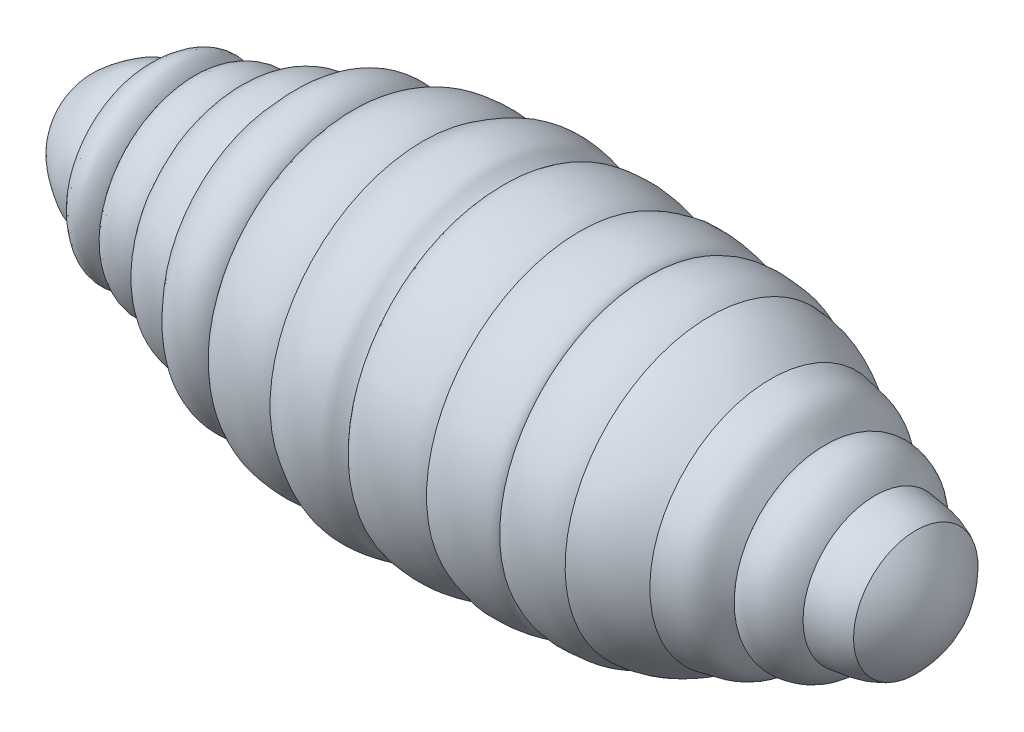
ISO-10303-21;
HEADER;
FILE_DESCRIPTION(('STEP AP214'),'2;1');
FILE_NAME('part.step','',(''),(''),'','','');
FILE_SCHEMA(('AUTOMOTIVE_DESIGN { 1 0 10303 214 1 1 1 1 }'));
ENDSEC;
DATA;
#1=APPLICATION_CONTEXT('core data for automotive mechanical design processes');
#2=APPLICATION_PROTOCOL_DEFINITION('international standard','automotive_design',2000,#1);
#3=PRODUCT_CONTEXT('',#1,'mechanical');
#4=PRODUCT('Part','Part','',(#3));
#5=PRODUCT_RELATED_PRODUCT_CATEGORY('part','',(#4));
#6=PRODUCT_DEFINITION_FORMATION('','',#4);
#7=PRODUCT_DEFINITION_CONTEXT('part definition',#1,'design');
#8=PRODUCT_DEFINITION('design','',#6,#7);
#9=PRODUCT_DEFINITION_SHAPE('','',#8);
#10=(LENGTH_UNIT() NAMED_UNIT(*) SI_UNIT(.MILLI.,.METRE.));
#11=(NAMED_UNIT(*) PLANE_ANGLE_UNIT() SI_UNIT($,.RADIAN.));
#12=(NAMED_UNIT(*) SI_UNIT($,.STERADIAN.) SOLID_ANGLE_UNIT());
#13=UNCERTAINTY_MEASURE_WITH_UNIT(LENGTH_MEASURE(1.E-05),#10,'distance_accuracy_value','');
#14=(GEOMETRIC_REPRESENTATION_CONTEXT(3) GLOBAL_UNCERTAINTY_ASSIGNED_CONTEXT((#13)) GLOBAL_UNIT_ASSIGNED_CONTEXT((#10,
#11,#12)) REPRESENTATION_CONTEXT('',''));
#15=CARTESIAN_POINT('',(0.,0.,0.));
#16=DIRECTION('',(0.,0.,1.));
#17=DIRECTION('',(1.,0.,0.));
#18=AXIS2_PLACEMENT_3D('',#15,#16,#17);
#19=CARTESIAN_POINT('',(-50.,0.,0.));
#20=CARTESIAN_POINT('',(-49.8904700324615,1.50509251192871,0.));
#21=CARTESIAN_POINT('',(-49.363729422387,4.50625430356472,0.));
#22=CARTESIAN_POINT('',(-46.5862063777801,6.57244305367213,0.));
#23=CARTESIAN_POINT('',(-44.381278745051,8.04243325560071,0.));
#24=CARTESIAN_POINT('',(-42.8694731297711,8.26708534150104,0.));
#25=CARTESIAN_POINT('',(-42.,8.28104738789359,0.));
#26=B_SPLINE_CURVE_WITH_KNOTS('',3,(#19,#20,#21,#22,#23,#24,#25),.UNSPECIFIED.,.F.,.F.,(4,1,1,1,
4),(0.,0.374016398351555,0.653478009580749,0.790960400203456,1.),.UNSPECIFIED.);
#27=CARTESIAN_POINT('',(-50.,0.,0.));
#28=DIRECTION('',(-1.,0.,0.));
#29=AXIS1_PLACEMENT('',#27,#28);
#30=SURFACE_OF_REVOLUTION('',#26,#29);
#31=CARTESIAN_POINT('',(-49.5476110758797,0.,0.));
#32=DIRECTION('',(-1.,0.,0.));
#33=DIRECTION('',(0.,-1.,0.));
#34=AXIS2_PLACEMENT_3D('',#31,#32,#33);
#35=CIRCLE('',#34,2.68430211931101);
#36=CARTESIAN_POINT('',(-49.5476110758797,-2.68430211931102,0.));
#37=VERTEX_POINT('',#36);
#38=EDGE_CURVE('E85',#37,#37,#35,.T.);
#39=ORIENTED_EDGE('',*,*,#38,.T.);
#40=EDGE_LOOP('',(#39));
#41=FACE_BOUND('',#40,.T.);
#42=CARTESIAN_POINT('',(-50.,0.,0.));
#43=VERTEX_POINT('',#42);
#44=VERTEX_LOOP('',#43);
#45=FACE_BOUND('',#44,.T.);
#46=ADVANCED_FACE('F35',(#41,#45),#30,.F.);
#47=CARTESIAN_POINT('',(50.,0.,0.));
#48=CARTESIAN_POINT('',(49.9997063551662,1.83528020877926,0.));
#49=CARTESIAN_POINT('',(49.1652497316057,3.63930144569189,0.));
#50=CARTESIAN_POINT('',(48.3309716119096,5.44293677307604,0.));
#51=CARTESIAN_POINT('',(46.6888712468462,7.15708657704143,0.));
#52=B_SPLINE_CURVE_WITH_KNOTS('',2,(#47,#48,#49,#50,#51),.UNSPECIFIED.,.F.,.F.,(3,2,3),(0.,0.5,
1.),.UNSPECIFIED.);
#53=CARTESIAN_POINT('',(-50.,0.,0.));
#54=DIRECTION('',(-1.,0.,0.));
#55=AXIS1_PLACEMENT('',#53,#54);
#56=SURFACE_OF_REVOLUTION('',#52,#55);
#57=CARTESIAN_POINT('',(46.6888712468464,0.,0.));
#58=DIRECTION('',(-1.,0.,0.));
#59=DIRECTION('',(0.,1.,0.));
#60=AXIS2_PLACEMENT_3D('',#57,#58,#59);
#61=CIRCLE('',#60,7.15708657704127);
#62=CARTESIAN_POINT('',(46.6888712468464,7.15708657704127,0.));
#63=VERTEX_POINT('',#62);
#64=EDGE_CURVE('E11',#63,#63,#61,.T.);
#65=ORIENTED_EDGE('',*,*,#64,.F.);
#66=EDGE_LOOP('',(#65));
#67=FACE_BOUND('',#66,.T.);
#68=CARTESIAN_POINT('',(50.,0.,0.));
#69=VERTEX_POINT('',#68);
#70=VERTEX_LOOP('',#69);
#71=FACE_BOUND('',#70,.T.);
#72=ADVANCED_FACE('F37',(#67,#71),#56,.T.);
#73=CARTESIAN_POINT('',(42.,8.28104738789359,0.));
#74=CARTESIAN_POINT('',(43.5955919784813,8.09543828768739,0.));
#75=CARTESIAN_POINT('',(45.2531179201532,7.96065524423312,0.));
#76=CARTESIAN_POINT('',(46.6888712468464,7.15708657704127,0.));
#77=B_SPLINE_CURVE_WITH_KNOTS('',3,(#73,#74,#75,#76),.UNSPECIFIED.,.F.,.F.,(4,4),(0.,1.),.UNSPECIFIED.);
#78=CARTESIAN_POINT('',(-50.,0.,0.));
#79=DIRECTION('',(-1.,0.,0.));
#80=AXIS1_PLACEMENT('',#78,#79);
#81=SURFACE_OF_REVOLUTION('',#77,#80);
#82=ORIENTED_EDGE('',*,*,#64,.T.);
#83=EDGE_LOOP('',(#82));
#84=FACE_BOUND('',#83,.T.);
#85=CARTESIAN_POINT('',(42.,0.,0.));
#86=DIRECTION('',(-1.,0.,0.));
#87=DIRECTION('',(0.,-1.,0.));
#88=AXIS2_PLACEMENT_3D('',#85,#86,#87);
#89=CIRCLE('',#88,8.28104738789359);
#90=CARTESIAN_POINT('',(42.,-8.28104738789358,0.));
#91=VERTEX_POINT('',#90);
#92=EDGE_CURVE('E47',#91,#91,#89,.T.);
#93=ORIENTED_EDGE('',*,*,#92,.F.);
#94=EDGE_LOOP('',(#93));
#95=FACE_BOUND('',#94,.T.);
#96=ADVANCED_FACE('F60',(#84,#95),#81,.F.);
#97=CARTESIAN_POINT('',(36.,10.0967700152084,0.));
#98=CARTESIAN_POINT('',(36.1648997740849,10.4394423191181,0.));
#99=CARTESIAN_POINT('',(36.6963517795307,10.8691492370424,0.));
#100=CARTESIAN_POINT('',(37.745862760455,11.0782128664449,0.));
#101=CARTESIAN_POINT('',(38.6875001009525,10.8757792862498,0.));
#102=CARTESIAN_POINT('',(39.765691934058,10.5497597271227,0.));
#103=CARTESIAN_POINT('',(40.8970845261141,9.68208773770644,0.));
#104=CARTESIAN_POINT('',(41.6422223563437,8.85342200247426,0.));
#105=CARTESIAN_POINT('',(42.,8.28104738789359,0.));
#106=B_SPLINE_CURVE_WITH_KNOTS('',3,(#97,#98,#99,#100,#101,#102,#103,#104,#105),.UNSPECIFIED.,
.F.,.F.,(4,1,1,1,1,1,4),(0.,0.152464572931677,0.266191497924167,0.427434588880055,
0.541585927712012,0.725793911544838,1.),.UNSPECIFIED.);
#107=CARTESIAN_POINT('',(-50.,0.,0.));
#108=DIRECTION('',(-1.,0.,0.));
#109=AXIS1_PLACEMENT('',#107,#108);
#110=SURFACE_OF_REVOLUTION('',#106,#109);
#111=ORIENTED_EDGE('',*,*,#92,.T.);
#112=EDGE_LOOP('',(#111));
#113=FACE_BOUND('',#112,.T.);
#114=CARTESIAN_POINT('',(36.,0.,0.));
#115=DIRECTION('',(-1.,0.,0.));
#116=DIRECTION('',(0.,-1.,0.));
#117=AXIS2_PLACEMENT_3D('',#114,#115,#116);
#118=CIRCLE('',#117,10.0967700152084);
#119=CARTESIAN_POINT('',(36.,-10.0967700152084,0.));
#120=VERTEX_POINT('',#119);
#121=EDGE_CURVE('E120',#120,#120,#118,.T.);
#122=ORIENTED_EDGE('',*,*,#121,.F.);
#123=EDGE_LOOP('',(#122));
#124=FACE_BOUND('',#123,.T.);
#125=ADVANCED_FACE('F139',(#113,#124),#110,.F.);
#126=CARTESIAN_POINT('',(30.,13.9037401965799,0.));
#127=CARTESIAN_POINT('',(31.1983333416806,13.6198257245417,0.));
#128=CARTESIAN_POINT('',(34.0789157247043,13.5061248181912,0.));
#129=CARTESIAN_POINT('',(35.3497922038353,11.0047350326224,0.));
#130=CARTESIAN_POINT('',(36.,10.0967700152084,0.));
#131=B_SPLINE_CURVE_WITH_KNOTS('',3,(#126,#127,#128,#129,#130),.UNSPECIFIED.,.F.,.F.,(4,1,4),
(0.,0.529447084413405,1.),.UNSPECIFIED.);
#132=CARTESIAN_POINT('',(-50.,0.,0.));
#133=DIRECTION('',(-1.,0.,0.));
#134=AXIS1_PLACEMENT('',#132,#133);
#135=SURFACE_OF_REVOLUTION('',#131,#134);
#136=ORIENTED_EDGE('',*,*,#121,.T.);
#137=EDGE_LOOP('',(#136));
#138=FACE_BOUND('',#137,.T.);
#139=CARTESIAN_POINT('',(30.,0.,0.));
#140=DIRECTION('',(-1.,0.,0.));
#141=DIRECTION('',(0.,-1.,0.));
#142=AXIS2_PLACEMENT_3D('',#139,#140,#141);
#143=CIRCLE('',#142,13.9037401965799);
#144=CARTESIAN_POINT('',(30.,-13.9037401965799,0.));
#145=VERTEX_POINT('',#144);
#146=EDGE_CURVE('E117',#145,#145,#143,.T.);
#147=ORIENTED_EDGE('',*,*,#146,.F.);
#148=EDGE_LOOP('',(#147));
#149=FACE_BOUND('',#148,.T.);
#150=ADVANCED_FACE('F169',(#138,#149),#135,.F.);
#151=CARTESIAN_POINT('',(23.,16.6479798239174,0.));
#152=CARTESIAN_POINT('',(25.6210132962744,16.5633102642351,0.));
#153=CARTESIAN_POINT('',(27.9044349307184,15.3073779247023,0.));
#154=CARTESIAN_POINT('',(30.,13.9037401965799,0.));
#155=B_SPLINE_CURVE_WITH_KNOTS('',3,(#151,#152,#153,#154),.UNSPECIFIED.,.F.,.F.,(4,4),(0.,1.),.UNSPECIFIED.);
#156=CARTESIAN_POINT('',(-50.,0.,0.));
#157=DIRECTION('',(-1.,0.,0.));
#158=AXIS1_PLACEMENT('',#156,#157);
#159=SURFACE_OF_REVOLUTION('',#155,#158);
#160=ORIENTED_EDGE('',*,*,#146,.T.);
#161=EDGE_LOOP('',(#160));
#162=FACE_BOUND('',#161,.T.);
#163=CARTESIAN_POINT('',(23.,0.,0.));
#164=DIRECTION('',(-1.,0.,0.));
#165=DIRECTION('',(0.,-1.,0.));
#166=AXIS2_PLACEMENT_3D('',#163,#164,#165);
#167=CIRCLE('',#166,16.6479798239174);
#168=CARTESIAN_POINT('',(23.,-16.6479798239174,0.));
#169=VERTEX_POINT('',#168);
#170=EDGE_CURVE('E114',#169,#169,#167,.T.);
#171=ORIENTED_EDGE('',*,*,#170,.F.);
#172=EDGE_LOOP('',(#171));
#173=FACE_BOUND('',#172,.T.);
#174=ADVANCED_FACE('F172',(#162,#173),#159,.F.);
#175=CARTESIAN_POINT('',(16.,17.1727696263886,0.));
#176=CARTESIAN_POINT('',(16.4092306846909,17.3968524585221,0.));
#177=CARTESIAN_POINT('',(17.0185438711078,17.5894532577867,0.));
#178=CARTESIAN_POINT('',(17.9071210774252,17.6388000058519,0.));
#179=CARTESIAN_POINT('',(18.2046930613381,17.6823657132867,0.));
#180=CARTESIAN_POINT('',(18.607659449331,17.6808848623169,0.));
#181=CARTESIAN_POINT('',(18.9514869908962,17.6412399103501,0.));
#182=CARTESIAN_POINT('',(20.3135688490514,17.5548759143627,0.));
#183=CARTESIAN_POINT('',(21.4096312816425,17.4389186139164,0.));
#184=CARTESIAN_POINT('',(22.5448340930615,16.9224433203292,0.));
#185=CARTESIAN_POINT('',(23.,16.6479798239174,0.));
#186=B_SPLINE_CURVE_WITH_KNOTS('',3,(#175,#176,#177,#178,#179,#180,#181,#182,#183,#184,#185),
.UNSPECIFIED.,.F.,.F.,(4,1,1,1,1,1,1,1,4),(0.,0.20115166025893,0.294305631612312,
0.364002236395487,0.3814152572732,0.468435840389441,0.54569185567994,0.779325231246277,1.),.UNSPECIFIED.);
#187=CARTESIAN_POINT('',(-50.,0.,0.));
#188=DIRECTION('',(-1.,0.,0.));
#189=AXIS1_PLACEMENT('',#187,#188);
#190=SURFACE_OF_REVOLUTION('',#186,#189);
#191=ORIENTED_EDGE('',*,*,#170,.T.);
#192=EDGE_LOOP('',(#191));
#193=FACE_BOUND('',#192,.T.);
#194=CARTESIAN_POINT('',(16.,0.,0.));
#195=DIRECTION('',(-1.,0.,0.));
#196=DIRECTION('',(0.,-1.,0.));
#197=AXIS2_PLACEMENT_3D('',#194,#195,#196);
#198=CIRCLE('',#197,17.1727696263885);
#199=CARTESIAN_POINT('',(16.,-17.1727696263885,0.));
#200=VERTEX_POINT('',#199);
#201=EDGE_CURVE('E111',#200,#200,#198,.T.);
#202=ORIENTED_EDGE('',*,*,#201,.F.);
#203=EDGE_LOOP('',(#202));
#204=FACE_BOUND('',#203,.T.);
#205=ADVANCED_FACE('F176',(#193,#204),#190,.F.);
#206=CARTESIAN_POINT('',(7.99999999999998,17.58879558299,0.));
#207=CARTESIAN_POINT('',(8.58195172244521,17.8804159787155,0.));
#208=CARTESIAN_POINT('',(9.43998916263691,18.0527990013269,0.));
#209=CARTESIAN_POINT('',(10.5081521326243,18.334125133584,0.));
#210=CARTESIAN_POINT('',(11.0618501999922,18.2976534538103,0.));
#211=CARTESIAN_POINT('',(11.5040455510617,18.2994251244907,0.));
#212=CARTESIAN_POINT('',(11.8663632179127,18.3093296074904,0.));
#213=CARTESIAN_POINT('',(12.2606155330468,18.2674280029491,0.));
#214=CARTESIAN_POINT('',(12.6390768169979,18.2311689979446,0.));
#215=CARTESIAN_POINT('',(12.9995380189958,18.1871859247805,0.));
#216=CARTESIAN_POINT('',(13.4294768607219,18.1315994240063,0.));
#217=CARTESIAN_POINT('',(14.0354190365389,18.0081948464241,0.));
#218=CARTESIAN_POINT('',(14.9736986439508,17.8254983824232,0.));
#219=CARTESIAN_POINT('',(15.7088977452917,17.5561704027527,0.));
#220=CARTESIAN_POINT('',(16.,17.1727696263885,0.));
#221=B_SPLINE_CURVE_WITH_KNOTS('',3,(#206,#207,#208,#209,#210,#211,#212,#213,#214,#215,#216,
#217,#218,#219,#220),.UNSPECIFIED.,.F.,.F.,(4,1,1,1,1,1,1,1,1,1,1,1,4),(0.,0.229372754582656,
0.317536007236325,0.393855893615315,0.427343111732747,0.476843965174335,0.524044558774018,
0.569820456887553,0.613701787293404,0.654707151740502,0.725801780216515,0.83593387589124,1.),.UNSPECIFIED.);
#222=CARTESIAN_POINT('',(-50.,0.,0.));
#223=DIRECTION('',(-1.,0.,0.));
#224=AXIS1_PLACEMENT('',#222,#223);
#225=SURFACE_OF_REVOLUTION('',#221,#224);
#226=ORIENTED_EDGE('',*,*,#201,.T.);
#227=EDGE_LOOP('',(#226));
#228=FACE_BOUND('',#227,.T.);
#229=CARTESIAN_POINT('',(7.99999999999999,0.,0.));
#230=DIRECTION('',(-1.,0.,0.));
#231=DIRECTION('',(0.,-1.,0.));
#232=AXIS2_PLACEMENT_3D('',#229,#230,#231);
#233=CIRCLE('',#232,17.58879558299);
#234=CARTESIAN_POINT('',(7.99999999999999,-17.58879558299,0.));
#235=VERTEX_POINT('',#234);
#236=EDGE_CURVE('E108',#235,#235,#233,.T.);
#237=ORIENTED_EDGE('',*,*,#236,.F.);
#238=EDGE_LOOP('',(#237));
#239=FACE_BOUND('',#238,.T.);
#240=ADVANCED_FACE('F180',(#228,#239),#225,.F.);
#241=CARTESIAN_POINT('',(-1.00000000000002,17.58879558299,0.));
#242=CARTESIAN_POINT('',(-0.614381517490259,18.1042013550658,0.));
#243=CARTESIAN_POINT('',(0.333735079944587,18.632641408761,0.));
#244=CARTESIAN_POINT('',(1.65279448140818,18.7237738313502,0.));
#245=CARTESIAN_POINT('',(2.53495210967577,18.794772533689,0.));
#246=CARTESIAN_POINT('',(3.2722451551941,18.7961807507217,0.));
#247=CARTESIAN_POINT('',(3.89160746997234,18.7458650543614,0.));
#248=CARTESIAN_POINT('',(4.47522000834908,18.667212173481,0.));
#249=CARTESIAN_POINT('',(4.99223252068977,18.5615601771135,0.));
#250=CARTESIAN_POINT('',(5.54256250629083,18.4666664859525,0.));
#251=CARTESIAN_POINT('',(6.11477590126522,18.2846224684002,0.));
#252=CARTESIAN_POINT('',(6.6811895763478,18.1832914009895,0.));
#253=CARTESIAN_POINT('',(7.33054937110865,17.9804058142008,0.));
#254=CARTESIAN_POINT('',(7.73759263743826,17.748797975174,0.));
#255=CARTESIAN_POINT('',(7.99999999999998,17.58879558299,0.));
#256=B_SPLINE_CURVE_WITH_KNOTS('',3,(#241,#242,#243,#244,#245,#246,#247,#248,#249,#250,#251,
#252,#253,#254,#255),.UNSPECIFIED.,.F.,.F.,(4,1,1,1,1,1,1,1,1,1,1,1,4),(0.,0.199993369543529,
0.323104104368617,0.414620343601679,0.47925154603547,0.555247359146551,0.610372734943505,
0.664792721977809,0.721612681011752,0.786226372903281,0.853650458042409,0.902782427386736,1.),.UNSPECIFIED.);
#257=CARTESIAN_POINT('',(-50.,0.,0.));
#258=DIRECTION('',(-1.,0.,0.));
#259=AXIS1_PLACEMENT('',#257,#258);
#260=SURFACE_OF_REVOLUTION('',#256,#259);
#261=ORIENTED_EDGE('',*,*,#236,.T.);
#262=EDGE_LOOP('',(#261));
#263=FACE_BOUND('',#262,.T.);
#264=CARTESIAN_POINT('',(-1.00000000000001,0.,0.));
#265=DIRECTION('',(-1.,0.,0.));
#266=DIRECTION('',(0.,-1.,0.));
#267=AXIS2_PLACEMENT_3D('',#264,#265,#266);
#268=CIRCLE('',#267,17.58879558299);
#269=CARTESIAN_POINT('',(-1.00000000000001,-17.58879558299,0.));
#270=VERTEX_POINT('',#269);
#271=EDGE_CURVE('E105',#270,#270,#268,.T.);
#272=ORIENTED_EDGE('',*,*,#271,.F.);
#273=EDGE_LOOP('',(#272));
#274=FACE_BOUND('',#273,.T.);
#275=ADVANCED_FACE('F208',(#263,#274),#260,.F.);
#276=CARTESIAN_POINT('',(-10.,17.58879558299,0.));
#277=CARTESIAN_POINT('',(-9.17764033625155,18.0865379526265,0.));
#278=CARTESIAN_POINT('',(-7.79833975548958,19.0069684286883,0.));
#279=CARTESIAN_POINT('',(-5.52354150623839,19.3180077940493,0.));
#280=CARTESIAN_POINT('',(-3.93611691289387,19.069156303444,0.));
#281=CARTESIAN_POINT('',(-2.28921186726228,18.7528788819492,0.));
#282=CARTESIAN_POINT('',(-1.61636299261944,17.8471970558595,0.));
#283=CARTESIAN_POINT('',(-1.00000000000002,17.58879558299,0.));
#284=B_SPLINE_CURVE_WITH_KNOTS('',3,(#276,#277,#278,#279,#280,#281,#282,#283),.UNSPECIFIED.,.F.,
.F.,(4,1,1,1,1,4),(0.,0.297871953056791,0.496695395077748,0.687344485397055,0.793867051889781,
1.),.UNSPECIFIED.);
#285=CARTESIAN_POINT('',(-50.,0.,0.));
#286=DIRECTION('',(-1.,0.,0.));
#287=AXIS1_PLACEMENT('',#285,#286);
#288=SURFACE_OF_REVOLUTION('',#284,#287);
#289=ORIENTED_EDGE('',*,*,#271,.T.);
#290=EDGE_LOOP('',(#289));
#291=FACE_BOUND('',#290,.T.);
#292=CARTESIAN_POINT('',(-10.,0.,0.));
#293=DIRECTION('',(-1.,0.,0.));
#294=DIRECTION('',(0.,-1.,0.));
#295=AXIS2_PLACEMENT_3D('',#292,#293,#294);
#296=CIRCLE('',#295,17.58879558299);
#297=CARTESIAN_POINT('',(-10.,-17.58879558299,0.));
#298=VERTEX_POINT('',#297);
#299=EDGE_CURVE('E102',#298,#298,#296,.T.);
#300=ORIENTED_EDGE('',*,*,#299,.F.);
#301=EDGE_LOOP('',(#300));
#302=FACE_BOUND('',#301,.T.);
#303=ADVANCED_FACE('F211',(#291,#302),#288,.F.);
#304=CARTESIAN_POINT('',(-19.,14.7813768868694,0.));
#305=CARTESIAN_POINT('',(-18.8759341950245,16.028850536088,0.));
#306=CARTESIAN_POINT('',(-17.5747081904575,17.2884400085088,0.));
#307=CARTESIAN_POINT('',(-15.5097710752355,18.0753626090936,0.));
#308=CARTESIAN_POINT('',(-14.0238921132705,18.2272210447954,0.));
#309=CARTESIAN_POINT('',(-12.1615104618129,18.3929705347467,0.));
#310=CARTESIAN_POINT('',(-10.7975743860364,18.0401145274624,0.));
#311=CARTESIAN_POINT('',(-10.,17.58879558299,0.));
#312=B_SPLINE_CURVE_WITH_KNOTS('',3,(#304,#305,#306,#307,#308,#309,#310,#311),.UNSPECIFIED.,.F.,
.F.,(4,1,1,1,1,4),(0.,0.324864627047122,0.474838109363639,0.616409351822741,0.743385769950866,
1.),.UNSPECIFIED.);
#313=CARTESIAN_POINT('',(-50.,0.,0.));
#314=DIRECTION('',(-1.,0.,0.));
#315=AXIS1_PLACEMENT('',#313,#314);
#316=SURFACE_OF_REVOLUTION('',#312,#315);
#317=ORIENTED_EDGE('',*,*,#299,.T.);
#318=EDGE_LOOP('',(#317));
#319=FACE_BOUND('',#318,.T.);
#320=CARTESIAN_POINT('',(-19.,0.,0.));
#321=DIRECTION('',(-1.,0.,0.));
#322=DIRECTION('',(0.,-1.,0.));
#323=AXIS2_PLACEMENT_3D('',#320,#321,#322);
#324=CIRCLE('',#323,14.7813768868694);
#325=CARTESIAN_POINT('',(-19.,-14.7813768868694,0.));
#326=VERTEX_POINT('',#325);
#327=EDGE_CURVE('E99',#326,#326,#324,.T.);
#328=ORIENTED_EDGE('',*,*,#327,.F.);
#329=EDGE_LOOP('',(#328));
#330=FACE_BOUND('',#329,.T.);
#331=ADVANCED_FACE('F215',(#319,#330),#316,.F.);
#332=CARTESIAN_POINT('',(-26.,13.9037401965799,0.));
#333=CARTESIAN_POINT('',(-25.2518993592873,14.6965988482443,0.));
#334=CARTESIAN_POINT('',(-24.2034123378488,16.1921795650815,0.));
#335=CARTESIAN_POINT('',(-22.1096612303888,16.6701797300599,0.));
#336=CARTESIAN_POINT('',(-20.3650098145285,16.3823642915235,0.));
#337=CARTESIAN_POINT('',(-19.344111288408,15.542594260465,0.));
#338=CARTESIAN_POINT('',(-19.,14.7813768868694,0.));
#339=B_SPLINE_CURVE_WITH_KNOTS('',3,(#332,#333,#334,#335,#336,#337,#338),.UNSPECIFIED.,.F.,.F.,
(4,1,1,1,4),(0.,0.396544676610702,0.574715816439164,0.715438823067215,1.),.UNSPECIFIED.);
#340=CARTESIAN_POINT('',(-50.,0.,0.));
#341=DIRECTION('',(-1.,0.,0.));
#342=AXIS1_PLACEMENT('',#340,#341);
#343=SURFACE_OF_REVOLUTION('',#339,#342);
#344=ORIENTED_EDGE('',*,*,#327,.T.);
#345=EDGE_LOOP('',(#344));
#346=FACE_BOUND('',#345,.T.);
#347=CARTESIAN_POINT('',(-26.,0.,0.));
#348=DIRECTION('',(-1.,0.,0.));
#349=DIRECTION('',(0.,-1.,0.));
#350=AXIS2_PLACEMENT_3D('',#347,#348,#349);
#351=CIRCLE('',#350,13.9037401965799);
#352=CARTESIAN_POINT('',(-26.,-13.9037401965799,0.));
#353=VERTEX_POINT('',#352);
#354=EDGE_CURVE('E96',#353,#353,#351,.T.);
#355=ORIENTED_EDGE('',*,*,#354,.F.);
#356=EDGE_LOOP('',(#355));
#357=FACE_BOUND('',#356,.T.);
#358=ADVANCED_FACE('F219',(#346,#357),#343,.F.);
#359=CARTESIAN_POINT('',(-32.,11.2075803757034,0.));
#360=CARTESIAN_POINT('',(-31.4638772632166,12.0955660328105,0.));
#361=CARTESIAN_POINT('',(-30.5043649253966,13.362444513894,0.));
#362=CARTESIAN_POINT('',(-28.2234485828988,14.2013610857232,0.));
#363=CARTESIAN_POINT('',(-26.870161366585,13.9918896528299,0.));
#364=CARTESIAN_POINT('',(-26.,13.9037401965799,0.));
#365=B_SPLINE_CURVE_WITH_KNOTS('',3,(#359,#360,#361,#362,#363,#364),.UNSPECIFIED.,.F.,.F.,(4,1,
1,4),(0.,0.44747716248506,0.624963351203104,1.),.UNSPECIFIED.);
#366=CARTESIAN_POINT('',(-50.,0.,0.));
#367=DIRECTION('',(-1.,0.,0.));
#368=AXIS1_PLACEMENT('',#366,#367);
#369=SURFACE_OF_REVOLUTION('',#365,#368);
#370=ORIENTED_EDGE('',*,*,#354,.T.);
#371=EDGE_LOOP('',(#370));
#372=FACE_BOUND('',#371,.T.);
#373=CARTESIAN_POINT('',(-32.,0.,0.));
#374=DIRECTION('',(-1.,0.,0.));
#375=DIRECTION('',(0.,-1.,0.));
#376=AXIS2_PLACEMENT_3D('',#373,#374,#375);
#377=CIRCLE('',#376,11.2075803757034);
#378=CARTESIAN_POINT('',(-32.,-11.2075803757034,0.));
#379=VERTEX_POINT('',#378);
#380=EDGE_CURVE('E93',#379,#379,#377,.T.);
#381=ORIENTED_EDGE('',*,*,#380,.F.);
#382=EDGE_LOOP('',(#381));
#383=FACE_BOUND('',#382,.T.);
#384=ADVANCED_FACE('F247',(#372,#383),#369,.F.);
#385=CARTESIAN_POINT('',(-37.,8.66945288548921,0.));
#386=CARTESIAN_POINT('',(-36.8749721801821,9.41025978415311,0.));
#387=CARTESIAN_POINT('',(-36.7552599978338,10.8605923923989,0.));
#388=CARTESIAN_POINT('',(-35.5564071743559,11.468057962562,0.));
#389=CARTESIAN_POINT('',(-34.9943321818747,11.7036733380231,0.));
#390=CARTESIAN_POINT('',(-34.3972152975765,11.7224176467875,0.));
#391=CARTESIAN_POINT('',(-33.846437797095,11.7326233010398,0.));
#392=CARTESIAN_POINT('',(-33.3520670008097,11.6817834967057,0.));
#393=CARTESIAN_POINT('',(-32.9352788683238,11.6252589245461,0.));
#394=CARTESIAN_POINT('',(-32.4910962335332,11.487967975443,0.));
#395=CARTESIAN_POINT('',(-32.1900861183029,11.3250953267541,0.));
#396=CARTESIAN_POINT('',(-32.,11.2075803757034,0.));
#397=B_SPLINE_CURVE_WITH_KNOTS('',3,(#385,#386,#387,#388,#389,#390,#391,#392,#393,#394,#395,
#396),.UNSPECIFIED.,.F.,.F.,(4,1,1,1,1,1,1,1,1,4),(0.,0.382043088140238,0.470299160207412,
0.564740486421525,0.641238461850231,0.723825005855344,0.80148270744285,0.854067904932874,
0.90400214142157,1.),.UNSPECIFIED.);
#398=CARTESIAN_POINT('',(-50.,0.,0.));
#399=DIRECTION('',(-1.,0.,0.));
#400=AXIS1_PLACEMENT('',#398,#399);
#401=SURFACE_OF_REVOLUTION('',#397,#400);
#402=ORIENTED_EDGE('',*,*,#380,.T.);
#403=EDGE_LOOP('',(#402));
#404=FACE_BOUND('',#403,.T.);
#405=CARTESIAN_POINT('',(-37.,0.,0.));
#406=DIRECTION('',(-1.,0.,0.));
#407=DIRECTION('',(0.,-1.,0.));
#408=AXIS2_PLACEMENT_3D('',#405,#406,#407);
#409=CIRCLE('',#408,8.66945288548921);
#410=CARTESIAN_POINT('',(-37.,-8.66945288548922,0.));
#411=VERTEX_POINT('',#410);
#412=EDGE_CURVE('E87',#411,#411,#409,.T.);
#413=ORIENTED_EDGE('',*,*,#412,.F.);
#414=EDGE_LOOP('',(#413));
#415=FACE_BOUND('',#414,.T.);
#416=ADVANCED_FACE('F75',(#404,#415),#401,.F.);
#417=CARTESIAN_POINT('',(-42.,8.28104738789359,0.));
#418=CARTESIAN_POINT('',(-41.9209287010521,9.13775934110989,0.));
#419=CARTESIAN_POINT('',(-41.0927699707231,10.0195843604941,0.));
#420=CARTESIAN_POINT('',(-39.8707565964733,10.8890489116063,0.));
#421=CARTESIAN_POINT('',(-38.9022368719954,10.9303643567224,0.));
#422=CARTESIAN_POINT('',(-38.3205906148382,10.5207063307879,0.));
#423=CARTESIAN_POINT('',(-37.6067246198915,9.86195286121483,0.));
#424=CARTESIAN_POINT('',(-37.2140574240501,9.18246585679756,0.));
#425=CARTESIAN_POINT('',(-37.,8.66945288548921,0.));
#426=B_SPLINE_CURVE_WITH_KNOTS('',3,(#417,#418,#419,#420,#421,#422,#423,#424,#425),
.UNSPECIFIED.,.F.,.F.,(4,1,1,1,1,1,4),(0.,0.321142072684023,0.48740985150513,0.601009198521195,
0.68932817555273,0.770139837392675,1.),.UNSPECIFIED.);
#427=CARTESIAN_POINT('',(-50.,0.,0.));
#428=DIRECTION('',(-1.,0.,0.));
#429=AXIS1_PLACEMENT('',#427,#428);
#430=SURFACE_OF_REVOLUTION('',#426,#429);
#431=ORIENTED_EDGE('',*,*,#412,.T.);
#432=EDGE_LOOP('',(#431));
#433=FACE_BOUND('',#432,.T.);
#434=CARTESIAN_POINT('',(-42.,0.,0.));
#435=DIRECTION('',(-1.,0.,0.));
#436=DIRECTION('',(0.,-1.,0.));
#437=AXIS2_PLACEMENT_3D('',#434,#435,#436);
#438=CIRCLE('',#437,8.2810473878936);
#439=CARTESIAN_POINT('',(-42.,-8.2810473878936,0.));
#440=VERTEX_POINT('',#439);
#441=EDGE_CURVE('E80',#440,#440,#438,.T.);
#442=ORIENTED_EDGE('',*,*,#441,.F.);
#443=EDGE_LOOP('',(#442));
#444=FACE_BOUND('',#443,.T.);
#445=ADVANCED_FACE('F68',(#433,#444),#430,.F.);
#446=ORIENTED_EDGE('',*,*,#441,.T.);
#447=EDGE_LOOP('',(#446));
#448=FACE_BOUND('',#447,.T.);
#449=CARTESIAN_POINT('',(-48.7083482863404,0.,0.));
#450=DIRECTION('',(-1.,0.,0.));
#451=DIRECTION('',(0.,-1.,0.));
#452=AXIS2_PLACEMENT_3D('',#449,#450,#451);
#453=CIRCLE('',#452,4.51657936436971);
#454=CARTESIAN_POINT('',(-48.7083482863404,-4.51657936436971,0.));
#455=VERTEX_POINT('',#454);
#456=EDGE_CURVE('E83',#455,#455,#453,.T.);
#457=ORIENTED_EDGE('',*,*,#456,.F.);
#458=EDGE_LOOP('',(#457));
#459=FACE_BOUND('',#458,.T.);
#460=ADVANCED_FACE('F56',(#448,#459),#30,.F.);
#461=CARTESIAN_POINT('',(0.,0.,0.));
#462=DIRECTION('',(0.,0.,1.));
#463=DIRECTION('',(-1.,0.,0.));
#464=AXIS2_PLACEMENT_3D('',#461,#462,#463);
#465=ELLIPSE('',#464,50.,20.);
#466=TRIMMED_CURVE('',#465,(PARAMETER_VALUE(3.14159265358979)),
(PARAMETER_VALUE(6.28318530717959)),.T.,.PARAMETER.);
#467=CARTESIAN_POINT('',(-50.,0.,0.));
#468=DIRECTION('',(-1.,0.,0.));
#469=AXIS1_PLACEMENT('',#467,#468);
#470=SURFACE_OF_REVOLUTION('',#466,#469);
#471=ORIENTED_EDGE('',*,*,#38,.F.);
#472=EDGE_LOOP('',(#471));
#473=FACE_BOUND('',#472,.T.);
#474=ORIENTED_EDGE('',*,*,#456,.T.);
#475=EDGE_LOOP('',(#474));
#476=FACE_BOUND('',#475,.T.);
#477=ADVANCED_FACE('F67',(#473,#476),#470,.T.);
#478=CLOSED_SHELL('',(#46,#72,#96,#125,#150,#174,#205,#240,#275,#303,#331,#358,#384,#416,#445,
#460,#477));
#479=MANIFOLD_SOLID_BREP('B2',#478);
#480=ADVANCED_BREP_SHAPE_REPRESENTATION('',(#18,#479),#14);
#481=SHAPE_DEFINITION_REPRESENTATION(#9,#480);
ENDSEC;
END-ISO-10303-21;
